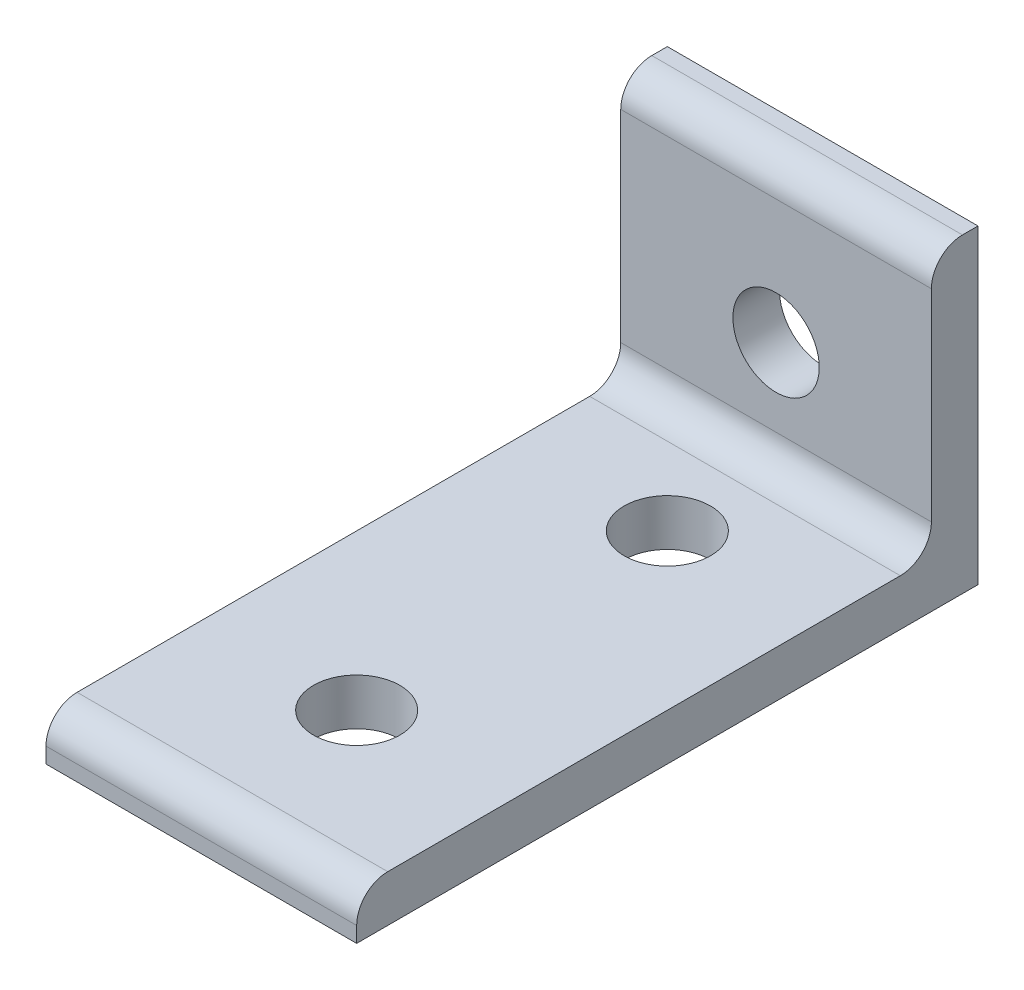
ISO-10303-21;
HEADER;
FILE_DESCRIPTION(('STEP AP214'),'2;1');
FILE_NAME('part.step','',(''),(''),'','','');
FILE_SCHEMA(('AUTOMOTIVE_DESIGN { 1 0 10303 214 1 1 1 1 }'));
ENDSEC;
DATA;
#1=APPLICATION_CONTEXT('core data for automotive mechanical design processes');
#2=APPLICATION_PROTOCOL_DEFINITION('international standard','automotive_design',2000,#1);
#3=PRODUCT_CONTEXT('',#1,'mechanical');
#4=PRODUCT('Part','Part','',(#3));
#5=PRODUCT_RELATED_PRODUCT_CATEGORY('part','',(#4));
#6=PRODUCT_DEFINITION_FORMATION('','',#4);
#7=PRODUCT_DEFINITION_CONTEXT('part definition',#1,'design');
#8=PRODUCT_DEFINITION('design','',#6,#7);
#9=PRODUCT_DEFINITION_SHAPE('','',#8);
#10=(LENGTH_UNIT() NAMED_UNIT(*) SI_UNIT(.MILLI.,.METRE.));
#11=(NAMED_UNIT(*) PLANE_ANGLE_UNIT() SI_UNIT($,.RADIAN.));
#12=(NAMED_UNIT(*) SI_UNIT($,.STERADIAN.) SOLID_ANGLE_UNIT());
#13=UNCERTAINTY_MEASURE_WITH_UNIT(LENGTH_MEASURE(1.E-05),#10,'distance_accuracy_value','');
#14=(GEOMETRIC_REPRESENTATION_CONTEXT(3) GLOBAL_UNCERTAINTY_ASSIGNED_CONTEXT((#13)) GLOBAL_UNIT_ASSIGNED_CONTEXT((#10,
#11,#12)) REPRESENTATION_CONTEXT('',''));
#15=CARTESIAN_POINT('',(0.,0.,0.));
#16=DIRECTION('',(0.,0.,1.));
#17=DIRECTION('',(1.,0.,0.));
#18=AXIS2_PLACEMENT_3D('',#15,#16,#17);
#19=CARTESIAN_POINT('',(10.,-9.00000000000002,20.));
#20=DIRECTION('',(0.,0.,-1.));
#21=DIRECTION('',(-1.,0.,0.));
#22=AXIS2_PLACEMENT_3D('',#19,#20,#21);
#23=PLANE('',#22);
#24=DIRECTION('',(0.,-1.,0.));
#25=VECTOR('',#24,1.);
#26=CARTESIAN_POINT('',(-10.,-9.00000000000002,20.));
#27=LINE('',#26,#25);
#28=CARTESIAN_POINT('',(-10.,-9.00000000000002,20.));
#29=VERTEX_POINT('',#28);
#30=CARTESIAN_POINT('',(-10.,-10.,20.));
#31=VERTEX_POINT('',#30);
#32=EDGE_CURVE('E137',#29,#31,#27,.T.);
#33=ORIENTED_EDGE('',*,*,#32,.T.);
#34=DIRECTION('',(-1.,0.,0.));
#35=VECTOR('',#34,1.);
#36=CARTESIAN_POINT('',(10.,-10.,20.));
#37=LINE('',#36,#35);
#38=CARTESIAN_POINT('',(10.,-10.,20.));
#39=VERTEX_POINT('',#38);
#40=EDGE_CURVE('E11',#39,#31,#37,.T.);
#41=ORIENTED_EDGE('',*,*,#40,.F.);
#42=DIRECTION('',(0.,-1.,0.));
#43=VECTOR('',#42,1.);
#44=CARTESIAN_POINT('',(10.,-9.00000000000002,20.));
#45=LINE('',#44,#43);
#46=CARTESIAN_POINT('',(10.,-9.00000000000002,20.));
#47=VERTEX_POINT('',#46);
#48=EDGE_CURVE('E154',#47,#39,#45,.T.);
#49=ORIENTED_EDGE('',*,*,#48,.F.);
#50=DIRECTION('',(-1.,0.,0.));
#51=VECTOR('',#50,1.);
#52=CARTESIAN_POINT('',(10.,-9.00000000000002,20.));
#53=LINE('',#52,#51);
#54=EDGE_CURVE('E133',#47,#29,#53,.T.);
#55=ORIENTED_EDGE('',*,*,#54,.T.);
#56=EDGE_LOOP('',(#33,#41,#49,#55));
#57=FACE_BOUND('',#56,.T.);
#58=ADVANCED_FACE('F33',(#57),#23,.F.);
#59=CARTESIAN_POINT('',(10.,-10.,20.));
#60=DIRECTION('',(0.,1.,0.));
#61=DIRECTION('',(0.,0.,1.));
#62=AXIS2_PLACEMENT_3D('',#59,#60,#61);
#63=PLANE('',#62);
#64=CARTESIAN_POINT('',(0.,-10.,10.));
#65=DIRECTION('',(0.,1.,0.));
#66=DIRECTION('',(0.,0.,1.));
#67=AXIS2_PLACEMENT_3D('',#64,#65,#66);
#68=CIRCLE('',#67,2.78);
#69=CARTESIAN_POINT('',(0.,-10.,12.78));
#70=VERTEX_POINT('',#69);
#71=EDGE_CURVE('E171',#70,#70,#68,.T.);
#72=ORIENTED_EDGE('',*,*,#71,.T.);
#73=EDGE_LOOP('',(#72));
#74=FACE_BOUND('',#73,.T.);
#75=CARTESIAN_POINT('',(0.,-10.,-10.));
#76=DIRECTION('',(0.,1.,0.));
#77=DIRECTION('',(0.,0.,1.));
#78=AXIS2_PLACEMENT_3D('',#75,#76,#77);
#79=CIRCLE('',#78,2.78);
#80=CARTESIAN_POINT('',(0.,-10.,-7.22));
#81=VERTEX_POINT('',#80);
#82=EDGE_CURVE('E174',#81,#81,#79,.T.);
#83=ORIENTED_EDGE('',*,*,#82,.T.);
#84=EDGE_LOOP('',(#83));
#85=FACE_BOUND('',#84,.T.);
#86=DIRECTION('',(0.,0.,-1.));
#87=VECTOR('',#86,1.);
#88=CARTESIAN_POINT('',(-10.,-10.,20.));
#89=LINE('',#88,#87);
#90=CARTESIAN_POINT('',(-10.,-10.,-20.));
#91=VERTEX_POINT('',#90);
#92=EDGE_CURVE('E140',#31,#91,#89,.T.);
#93=ORIENTED_EDGE('',*,*,#92,.T.);
#94=DIRECTION('',(-1.,0.,0.));
#95=VECTOR('',#94,1.);
#96=CARTESIAN_POINT('',(10.,-10.,-20.));
#97=LINE('',#96,#95);
#98=CARTESIAN_POINT('',(10.,-10.,-20.));
#99=VERTEX_POINT('',#98);
#100=EDGE_CURVE('E42',#99,#91,#97,.T.);
#101=ORIENTED_EDGE('',*,*,#100,.F.);
#102=DIRECTION('',(0.,0.,-1.));
#103=VECTOR('',#102,1.);
#104=CARTESIAN_POINT('',(10.,-10.,20.));
#105=LINE('',#104,#103);
#106=EDGE_CURVE('E97',#39,#99,#105,.T.);
#107=ORIENTED_EDGE('',*,*,#106,.F.);
#108=ORIENTED_EDGE('',*,*,#40,.T.);
#109=EDGE_LOOP('',(#93,#101,#107,#108));
#110=FACE_BOUND('',#109,.T.);
#111=ADVANCED_FACE('F223',(#74,#85,#110),#63,.F.);
#112=CARTESIAN_POINT('',(10.,-10.,-20.));
#113=DIRECTION('',(0.,0.,1.));
#114=DIRECTION('',(1.,0.,0.));
#115=AXIS2_PLACEMENT_3D('',#112,#113,#114);
#116=PLANE('',#115);
#117=CARTESIAN_POINT('',(0.,0.,-20.));
#118=DIRECTION('',(0.,0.,1.));
#119=DIRECTION('',(1.,0.,0.));
#120=AXIS2_PLACEMENT_3D('',#117,#118,#119);
#121=CIRCLE('',#120,2.78);
#122=CARTESIAN_POINT('',(2.78,0.,-20.));
#123=VERTEX_POINT('',#122);
#124=EDGE_CURVE('E141',#123,#123,#121,.T.);
#125=ORIENTED_EDGE('',*,*,#124,.T.);
#126=EDGE_LOOP('',(#125));
#127=FACE_BOUND('',#126,.T.);
#128=DIRECTION('',(0.,1.,0.));
#129=VECTOR('',#128,1.);
#130=CARTESIAN_POINT('',(-10.,-10.,-20.));
#131=LINE('',#130,#129);
#132=CARTESIAN_POINT('',(-10.,10.,-20.));
#133=VERTEX_POINT('',#132);
#134=EDGE_CURVE('E143',#91,#133,#131,.T.);
#135=ORIENTED_EDGE('',*,*,#134,.T.);
#136=DIRECTION('',(-1.,0.,0.));
#137=VECTOR('',#136,1.);
#138=CARTESIAN_POINT('',(10.,10.,-20.));
#139=LINE('',#138,#137);
#140=CARTESIAN_POINT('',(10.,10.,-20.));
#141=VERTEX_POINT('',#140);
#142=EDGE_CURVE('E164',#141,#133,#139,.T.);
#143=ORIENTED_EDGE('',*,*,#142,.F.);
#144=DIRECTION('',(0.,1.,0.));
#145=VECTOR('',#144,1.);
#146=CARTESIAN_POINT('',(10.,-10.,-20.));
#147=LINE('',#146,#145);
#148=EDGE_CURVE('E189',#99,#141,#147,.T.);
#149=ORIENTED_EDGE('',*,*,#148,.F.);
#150=ORIENTED_EDGE('',*,*,#100,.T.);
#151=EDGE_LOOP('',(#135,#143,#149,#150));
#152=FACE_BOUND('',#151,.T.);
#153=ADVANCED_FACE('F227',(#127,#152),#116,.F.);
#154=CARTESIAN_POINT('',(10.,10.,-20.));
#155=DIRECTION('',(0.,-1.,0.));
#156=DIRECTION('',(0.,0.,-1.));
#157=AXIS2_PLACEMENT_3D('',#154,#155,#156);
#158=PLANE('',#157);
#159=DIRECTION('',(0.,0.,1.));
#160=VECTOR('',#159,1.);
#161=CARTESIAN_POINT('',(-10.,10.,-20.));
#162=LINE('',#161,#160);
#163=CARTESIAN_POINT('',(-10.,10.,-19.));
#164=VERTEX_POINT('',#163);
#165=EDGE_CURVE('E145',#133,#164,#162,.T.);
#166=ORIENTED_EDGE('',*,*,#165,.T.);
#167=DIRECTION('',(-1.,0.,0.));
#168=VECTOR('',#167,1.);
#169=CARTESIAN_POINT('',(10.,10.,-19.));
#170=LINE('',#169,#168);
#171=CARTESIAN_POINT('',(10.,10.,-19.));
#172=VERTEX_POINT('',#171);
#173=EDGE_CURVE('E161',#172,#164,#170,.T.);
#174=ORIENTED_EDGE('',*,*,#173,.F.);
#175=DIRECTION('',(0.,0.,1.));
#176=VECTOR('',#175,1.);
#177=CARTESIAN_POINT('',(10.,10.,-20.));
#178=LINE('',#177,#176);
#179=EDGE_CURVE('E191',#141,#172,#178,.T.);
#180=ORIENTED_EDGE('',*,*,#179,.F.);
#181=ORIENTED_EDGE('',*,*,#142,.T.);
#182=EDGE_LOOP('',(#166,#174,#180,#181));
#183=FACE_BOUND('',#182,.T.);
#184=ADVANCED_FACE('F232',(#183),#158,.F.);
#185=CARTESIAN_POINT('',(10.,8.,-19.));
#186=DIRECTION('',(-1.,0.,0.));
#187=DIRECTION('',(0.,0.,1.));
#188=AXIS2_PLACEMENT_3D('',#185,#186,#187);
#189=CYLINDRICAL_SURFACE('',#188,2.);
#190=CARTESIAN_POINT('',(-10.,8.,-19.));
#191=DIRECTION('',(1.,0.,0.));
#192=DIRECTION('',(0.,0.,-1.));
#193=AXIS2_PLACEMENT_3D('',#190,#191,#192);
#194=CIRCLE('',#193,2.);
#195=CARTESIAN_POINT('',(-10.,7.99999999999998,-17.));
#196=VERTEX_POINT('',#195);
#197=EDGE_CURVE('E147',#164,#196,#194,.T.);
#198=ORIENTED_EDGE('',*,*,#197,.T.);
#199=DIRECTION('',(-1.,0.,0.));
#200=VECTOR('',#199,1.);
#201=CARTESIAN_POINT('',(10.,7.99999999999998,-17.));
#202=LINE('',#201,#200);
#203=CARTESIAN_POINT('',(10.,7.99999999999998,-17.));
#204=VERTEX_POINT('',#203);
#205=EDGE_CURVE('E158',#204,#196,#202,.T.);
#206=ORIENTED_EDGE('',*,*,#205,.F.);
#207=CARTESIAN_POINT('',(10.,8.,-19.));
#208=DIRECTION('',(1.,0.,0.));
#209=DIRECTION('',(0.,0.,-1.));
#210=AXIS2_PLACEMENT_3D('',#207,#208,#209);
#211=CIRCLE('',#210,2.);
#212=EDGE_CURVE('E193',#172,#204,#211,.T.);
#213=ORIENTED_EDGE('',*,*,#212,.F.);
#214=ORIENTED_EDGE('',*,*,#173,.T.);
#215=EDGE_LOOP('',(#198,#206,#213,#214));
#216=FACE_BOUND('',#215,.T.);
#217=ADVANCED_FACE('F199',(#216),#189,.T.);
#218=CARTESIAN_POINT('',(10.,7.99999999999998,-17.));
#219=DIRECTION('',(0.,0.,-1.));
#220=DIRECTION('',(0.,1.,0.));
#221=AXIS2_PLACEMENT_3D('',#218,#219,#220);
#222=PLANE('',#221);
#223=CARTESIAN_POINT('',(0.,0.,-17.));
#224=DIRECTION('',(0.,0.,-1.));
#225=DIRECTION('',(0.,1.,0.));
#226=AXIS2_PLACEMENT_3D('',#223,#224,#225);
#227=CIRCLE('',#226,2.78);
#228=CARTESIAN_POINT('',(0.,2.78,-17.));
#229=VERTEX_POINT('',#228);
#230=EDGE_CURVE('E169',#229,#229,#227,.T.);
#231=ORIENTED_EDGE('',*,*,#230,.T.);
#232=EDGE_LOOP('',(#231));
#233=FACE_BOUND('',#232,.T.);
#234=DIRECTION('',(0.,-1.,0.));
#235=VECTOR('',#234,1.);
#236=CARTESIAN_POINT('',(-10.,7.99999999999998,-17.));
#237=LINE('',#236,#235);
#238=CARTESIAN_POINT('',(-10.,-4.99999999999998,-17.));
#239=VERTEX_POINT('',#238);
#240=EDGE_CURVE('E149',#196,#239,#237,.T.);
#241=ORIENTED_EDGE('',*,*,#240,.T.);
#242=DIRECTION('',(-1.,0.,0.));
#243=VECTOR('',#242,1.);
#244=CARTESIAN_POINT('',(10.,-4.99999999999998,-17.));
#245=LINE('',#244,#243);
#246=CARTESIAN_POINT('',(10.,-4.99999999999998,-17.));
#247=VERTEX_POINT('',#246);
#248=EDGE_CURVE('E128',#247,#239,#245,.T.);
#249=ORIENTED_EDGE('',*,*,#248,.F.);
#250=DIRECTION('',(0.,-1.,0.));
#251=VECTOR('',#250,1.);
#252=CARTESIAN_POINT('',(10.,7.99999999999998,-17.));
#253=LINE('',#252,#251);
#254=EDGE_CURVE('E119',#204,#247,#253,.T.);
#255=ORIENTED_EDGE('',*,*,#254,.F.);
#256=ORIENTED_EDGE('',*,*,#205,.T.);
#257=EDGE_LOOP('',(#241,#249,#255,#256));
#258=FACE_BOUND('',#257,.T.);
#259=ADVANCED_FACE('F203',(#233,#258),#222,.F.);
#260=CARTESIAN_POINT('',(10.,-5.,-15.));
#261=DIRECTION('',(-1.,0.,0.));
#262=DIRECTION('',(0.,0.,1.));
#263=AXIS2_PLACEMENT_3D('',#260,#261,#262);
#264=CYLINDRICAL_SURFACE('',#263,2.);
#265=CARTESIAN_POINT('',(-10.,-5.,-15.));
#266=DIRECTION('',(-1.,0.,0.));
#267=DIRECTION('',(0.,0.,1.));
#268=AXIS2_PLACEMENT_3D('',#265,#266,#267);
#269=CIRCLE('',#268,2.);
#270=CARTESIAN_POINT('',(-10.,-7.,-15.));
#271=VERTEX_POINT('',#270);
#272=EDGE_CURVE('E127',#239,#271,#269,.T.);
#273=ORIENTED_EDGE('',*,*,#272,.T.);
#274=DIRECTION('',(-1.,0.,0.));
#275=VECTOR('',#274,1.);
#276=CARTESIAN_POINT('',(10.,-7.,-15.));
#277=LINE('',#276,#275);
#278=CARTESIAN_POINT('',(10.,-7.,-15.));
#279=VERTEX_POINT('',#278);
#280=EDGE_CURVE('E124',#279,#271,#277,.T.);
#281=ORIENTED_EDGE('',*,*,#280,.F.);
#282=CARTESIAN_POINT('',(10.,-5.,-15.));
#283=DIRECTION('',(-1.,0.,0.));
#284=DIRECTION('',(0.,0.,1.));
#285=AXIS2_PLACEMENT_3D('',#282,#283,#284);
#286=CIRCLE('',#285,2.);
#287=EDGE_CURVE('E113',#247,#279,#286,.T.);
#288=ORIENTED_EDGE('',*,*,#287,.F.);
#289=ORIENTED_EDGE('',*,*,#248,.T.);
#290=EDGE_LOOP('',(#273,#281,#288,#289));
#291=FACE_BOUND('',#290,.T.);
#292=ADVANCED_FACE('F125',(#291),#264,.F.);
#293=CARTESIAN_POINT('',(10.,-7.,-15.));
#294=DIRECTION('',(0.,-1.,0.));
#295=DIRECTION('',(0.,0.,-1.));
#296=AXIS2_PLACEMENT_3D('',#293,#294,#295);
#297=PLANE('',#296);
#298=CARTESIAN_POINT('',(0.,-7.,10.));
#299=DIRECTION('',(0.,-1.,0.));
#300=DIRECTION('',(0.,0.,-1.));
#301=AXIS2_PLACEMENT_3D('',#298,#299,#300);
#302=CIRCLE('',#301,2.78);
#303=CARTESIAN_POINT('',(0.,-7.,7.22));
#304=VERTEX_POINT('',#303);
#305=EDGE_CURVE('E36',#304,#304,#302,.T.);
#306=ORIENTED_EDGE('',*,*,#305,.T.);
#307=EDGE_LOOP('',(#306));
#308=FACE_BOUND('',#307,.T.);
#309=CARTESIAN_POINT('',(0.,-7.,-10.));
#310=DIRECTION('',(0.,-1.,0.));
#311=DIRECTION('',(0.,0.,-1.));
#312=AXIS2_PLACEMENT_3D('',#309,#310,#311);
#313=CIRCLE('',#312,2.78);
#314=CARTESIAN_POINT('',(0.,-7.,-12.78));
#315=VERTEX_POINT('',#314);
#316=EDGE_CURVE('E172',#315,#315,#313,.T.);
#317=ORIENTED_EDGE('',*,*,#316,.T.);
#318=EDGE_LOOP('',(#317));
#319=FACE_BOUND('',#318,.T.);
#320=DIRECTION('',(0.,0.,1.));
#321=VECTOR('',#320,1.);
#322=CARTESIAN_POINT('',(-10.,-7.,-15.));
#323=LINE('',#322,#321);
#324=CARTESIAN_POINT('',(-10.,-7.,18.));
#325=VERTEX_POINT('',#324);
#326=EDGE_CURVE('E83',#271,#325,#323,.T.);
#327=ORIENTED_EDGE('',*,*,#326,.T.);
#328=DIRECTION('',(-1.,0.,0.));
#329=VECTOR('',#328,1.);
#330=CARTESIAN_POINT('',(10.,-7.,18.));
#331=LINE('',#330,#329);
#332=CARTESIAN_POINT('',(10.,-7.,18.));
#333=VERTEX_POINT('',#332);
#334=EDGE_CURVE('E129',#333,#325,#331,.T.);
#335=ORIENTED_EDGE('',*,*,#334,.F.);
#336=DIRECTION('',(0.,0.,1.));
#337=VECTOR('',#336,1.);
#338=CARTESIAN_POINT('',(10.,-7.,-15.));
#339=LINE('',#338,#337);
#340=EDGE_CURVE('E117',#279,#333,#339,.T.);
#341=ORIENTED_EDGE('',*,*,#340,.F.);
#342=ORIENTED_EDGE('',*,*,#280,.T.);
#343=EDGE_LOOP('',(#327,#335,#341,#342));
#344=FACE_BOUND('',#343,.T.);
#345=ADVANCED_FACE('F131',(#308,#319,#344),#297,.F.);
#346=CARTESIAN_POINT('',(10.,-9.,18.));
#347=DIRECTION('',(-1.,0.,0.));
#348=DIRECTION('',(0.,0.,1.));
#349=AXIS2_PLACEMENT_3D('',#346,#347,#348);
#350=CYLINDRICAL_SURFACE('',#349,2.);
#351=CARTESIAN_POINT('',(-10.,-9.,18.));
#352=DIRECTION('',(1.,0.,0.));
#353=DIRECTION('',(0.,0.,-1.));
#354=AXIS2_PLACEMENT_3D('',#351,#352,#353);
#355=CIRCLE('',#354,2.);
#356=EDGE_CURVE('E89',#325,#29,#355,.T.);
#357=ORIENTED_EDGE('',*,*,#356,.T.);
#358=ORIENTED_EDGE('',*,*,#54,.F.);
#359=CARTESIAN_POINT('',(10.,-9.,18.));
#360=DIRECTION('',(1.,0.,0.));
#361=DIRECTION('',(0.,0.,-1.));
#362=AXIS2_PLACEMENT_3D('',#359,#360,#361);
#363=CIRCLE('',#362,2.);
#364=EDGE_CURVE('E51',#333,#47,#363,.T.);
#365=ORIENTED_EDGE('',*,*,#364,.F.);
#366=ORIENTED_EDGE('',*,*,#334,.T.);
#367=EDGE_LOOP('',(#357,#358,#365,#366));
#368=FACE_BOUND('',#367,.T.);
#369=ADVANCED_FACE('F211',(#368),#350,.T.);
#370=CARTESIAN_POINT('',(10.,8.,-19.));
#371=DIRECTION('',(1.,0.,0.));
#372=DIRECTION('',(0.,0.,-1.));
#373=AXIS2_PLACEMENT_3D('',#370,#371,#372);
#374=PLANE('',#373);
#375=ORIENTED_EDGE('',*,*,#48,.T.);
#376=ORIENTED_EDGE('',*,*,#106,.T.);
#377=ORIENTED_EDGE('',*,*,#148,.T.);
#378=ORIENTED_EDGE('',*,*,#179,.T.);
#379=ORIENTED_EDGE('',*,*,#212,.T.);
#380=ORIENTED_EDGE('',*,*,#254,.T.);
#381=ORIENTED_EDGE('',*,*,#287,.T.);
#382=ORIENTED_EDGE('',*,*,#340,.T.);
#383=ORIENTED_EDGE('',*,*,#364,.T.);
#384=EDGE_LOOP('',(#375,#376,#377,#378,#379,#380,#381,#382,#383));
#385=FACE_BOUND('',#384,.T.);
#386=ADVANCED_FACE('F115',(#385),#374,.T.);
#387=CARTESIAN_POINT('',(-10.,8.,-19.));
#388=DIRECTION('',(1.,0.,0.));
#389=DIRECTION('',(0.,0.,-1.));
#390=AXIS2_PLACEMENT_3D('',#387,#388,#389);
#391=PLANE('',#390);
#392=ORIENTED_EDGE('',*,*,#32,.F.);
#393=ORIENTED_EDGE('',*,*,#356,.F.);
#394=ORIENTED_EDGE('',*,*,#326,.F.);
#395=ORIENTED_EDGE('',*,*,#272,.F.);
#396=ORIENTED_EDGE('',*,*,#240,.F.);
#397=ORIENTED_EDGE('',*,*,#197,.F.);
#398=ORIENTED_EDGE('',*,*,#165,.F.);
#399=ORIENTED_EDGE('',*,*,#134,.F.);
#400=ORIENTED_EDGE('',*,*,#92,.F.);
#401=EDGE_LOOP('',(#392,#393,#394,#395,#396,#397,#398,#399,#400));
#402=FACE_BOUND('',#401,.T.);
#403=ADVANCED_FACE('F206',(#402),#391,.F.);
#404=CARTESIAN_POINT('',(0.,0.,20.));
#405=DIRECTION('',(0.,0.,-1.));
#406=DIRECTION('',(-1.,0.,0.));
#407=AXIS2_PLACEMENT_3D('',#404,#405,#406);
#408=CYLINDRICAL_SURFACE('',#407,2.78);
#409=ORIENTED_EDGE('',*,*,#230,.F.);
#410=EDGE_LOOP('',(#409));
#411=FACE_BOUND('',#410,.T.);
#412=ORIENTED_EDGE('',*,*,#124,.F.);
#413=EDGE_LOOP('',(#412));
#414=FACE_BOUND('',#413,.T.);
#415=ADVANCED_FACE('F269',(#411,#414),#408,.F.);
#416=CARTESIAN_POINT('',(0.,10.,-10.));
#417=DIRECTION('',(0.,-1.,0.));
#418=DIRECTION('',(0.,0.,-1.));
#419=AXIS2_PLACEMENT_3D('',#416,#417,#418);
#420=CYLINDRICAL_SURFACE('',#419,2.78);
#421=ORIENTED_EDGE('',*,*,#316,.F.);
#422=EDGE_LOOP('',(#421));
#423=FACE_BOUND('',#422,.T.);
#424=ORIENTED_EDGE('',*,*,#82,.F.);
#425=EDGE_LOOP('',(#424));
#426=FACE_BOUND('',#425,.T.);
#427=ADVANCED_FACE('F263',(#423,#426),#420,.F.);
#428=CARTESIAN_POINT('',(0.,10.,10.));
#429=DIRECTION('',(0.,-1.,0.));
#430=DIRECTION('',(0.,0.,-1.));
#431=AXIS2_PLACEMENT_3D('',#428,#429,#430);
#432=CYLINDRICAL_SURFACE('',#431,2.78);
#433=ORIENTED_EDGE('',*,*,#305,.F.);
#434=EDGE_LOOP('',(#433));
#435=FACE_BOUND('',#434,.T.);
#436=ORIENTED_EDGE('',*,*,#71,.F.);
#437=EDGE_LOOP('',(#436));
#438=FACE_BOUND('',#437,.T.);
#439=ADVANCED_FACE('F268',(#435,#438),#432,.F.);
#440=CLOSED_SHELL('',(#58,#111,#153,#184,#217,#259,#292,#345,#369,#386,#403,#415,#427,#439));
#441=MANIFOLD_SOLID_BREP('B2',#440);
#442=ADVANCED_BREP_SHAPE_REPRESENTATION('',(#18,#441),#14);
#443=SHAPE_DEFINITION_REPRESENTATION(#9,#442);
ENDSEC;
END-ISO-10303-21;
